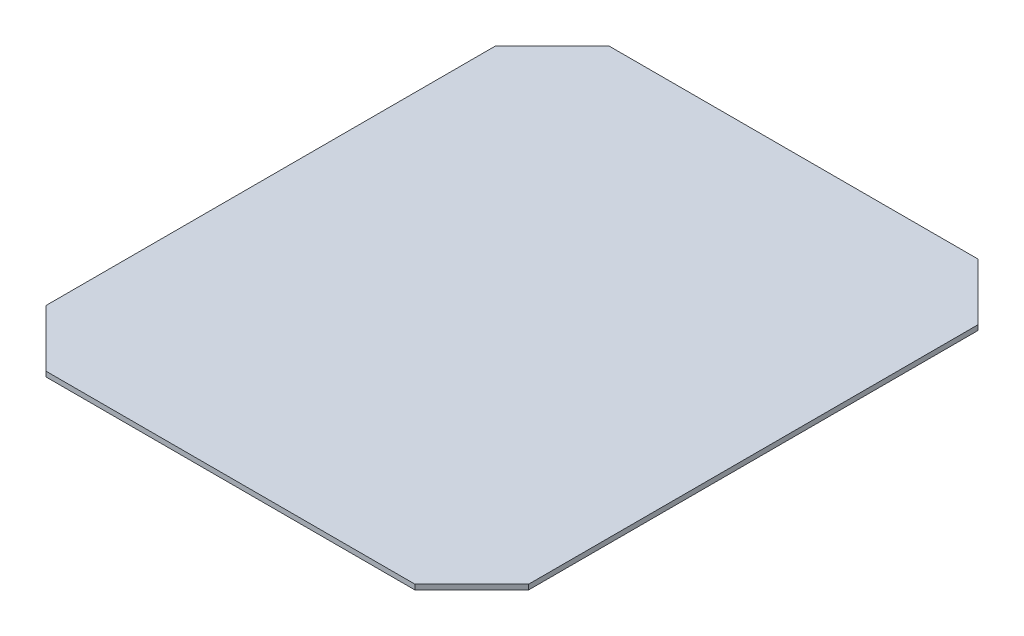
ISO-10303-21;
HEADER;
FILE_DESCRIPTION(('STEP AP214'),'2;1');
FILE_NAME('part.step','',(''),(''),'','','');
FILE_SCHEMA(('AUTOMOTIVE_DESIGN { 1 0 10303 214 1 1 1 1 }'));
ENDSEC;
DATA;
#1=APPLICATION_CONTEXT('core data for automotive mechanical design processes');
#2=APPLICATION_PROTOCOL_DEFINITION('international standard','automotive_design',2000,#1);
#3=PRODUCT_CONTEXT('',#1,'mechanical');
#4=PRODUCT('Part','Part','',(#3));
#5=PRODUCT_RELATED_PRODUCT_CATEGORY('part','',(#4));
#6=PRODUCT_DEFINITION_FORMATION('','',#4);
#7=PRODUCT_DEFINITION_CONTEXT('part definition',#1,'design');
#8=PRODUCT_DEFINITION('design','',#6,#7);
#9=PRODUCT_DEFINITION_SHAPE('','',#8);
#10=(LENGTH_UNIT() NAMED_UNIT(*) SI_UNIT(.MILLI.,.METRE.));
#11=(NAMED_UNIT(*) PLANE_ANGLE_UNIT() SI_UNIT($,.RADIAN.));
#12=(NAMED_UNIT(*) SI_UNIT($,.STERADIAN.) SOLID_ANGLE_UNIT());
#13=UNCERTAINTY_MEASURE_WITH_UNIT(LENGTH_MEASURE(1.E-05),#10,'distance_accuracy_value','');
#14=(GEOMETRIC_REPRESENTATION_CONTEXT(3) GLOBAL_UNCERTAINTY_ASSIGNED_CONTEXT((#13)) GLOBAL_UNIT_ASSIGNED_CONTEXT((#10,
#11,#12)) REPRESENTATION_CONTEXT('',''));
#15=CARTESIAN_POINT('',(0.,0.,0.));
#16=DIRECTION('',(0.,0.,1.));
#17=DIRECTION('',(1.,0.,0.));
#18=AXIS2_PLACEMENT_3D('',#15,#16,#17);
#19=CARTESIAN_POINT('',(-61.7660498386658,3.175,0.));
#20=DIRECTION('',(1.,0.,0.));
#21=DIRECTION('',(0.,0.,-1.));
#22=AXIS2_PLACEMENT_3D('',#19,#20,#21);
#23=PLANE('',#22);
#24=DIRECTION('',(0.,0.,1.));
#25=VECTOR('',#24,1.);
#26=CARTESIAN_POINT('',(-61.7660498386658,0.,0.));
#27=LINE('',#26,#25);
#28=CARTESIAN_POINT('',(-61.7660498386658,0.,-66.5353355825896));
#29=VERTEX_POINT('',#28);
#30=CARTESIAN_POINT('',(-61.7660498386657,0.,217.222615448857));
#31=VERTEX_POINT('',#30);
#32=EDGE_CURVE('E132',#29,#31,#27,.T.);
#33=ORIENTED_EDGE('',*,*,#32,.T.);
#34=DIRECTION('',(0.,-1.,0.));
#35=VECTOR('',#34,1.);
#36=CARTESIAN_POINT('',(-61.7660498386657,3.175,217.222615448857));
#37=LINE('',#36,#35);
#38=CARTESIAN_POINT('',(-61.7660498386657,3.175,217.222615448857));
#39=VERTEX_POINT('',#38);
#40=EDGE_CURVE('E11',#39,#31,#37,.T.);
#41=ORIENTED_EDGE('',*,*,#40,.F.);
#42=DIRECTION('',(0.,0.,1.));
#43=VECTOR('',#42,1.);
#44=CARTESIAN_POINT('',(-61.7660498386658,3.175,0.));
#45=LINE('',#44,#43);
#46=CARTESIAN_POINT('',(-61.7660498386658,3.175,-66.5353355825896));
#47=VERTEX_POINT('',#46);
#48=EDGE_CURVE('E151',#47,#39,#45,.T.);
#49=ORIENTED_EDGE('',*,*,#48,.F.);
#50=DIRECTION('',(0.,-1.,0.));
#51=VECTOR('',#50,1.);
#52=CARTESIAN_POINT('',(-61.7660498386658,3.175,-66.5353355825896));
#53=LINE('',#52,#51);
#54=EDGE_CURVE('E51',#47,#29,#53,.T.);
#55=ORIENTED_EDGE('',*,*,#54,.T.);
#56=EDGE_LOOP('',(#33,#41,#49,#55));
#57=FACE_BOUND('',#56,.T.);
#58=ADVANCED_FACE('F35',(#57),#23,.F.);
#59=CARTESIAN_POINT('',(-139.494332643761,3.175,139.494332643761));
#60=DIRECTION('',(0.707106781186548,0.,-0.707106781186547));
#61=DIRECTION('',(-0.707106781186547,0.,-0.707106781186548));
#62=AXIS2_PLACEMENT_3D('',#59,#60,#61);
#63=PLANE('',#62);
#64=DIRECTION('',(0.707106781186547,0.,0.707106781186548));
#65=VECTOR('',#64,1.);
#66=CARTESIAN_POINT('',(-139.494332643761,0.,139.494332643761));
#67=LINE('',#66,#65);
#68=CARTESIAN_POINT('',(-25.845025354389,0.,253.143639933134));
#69=VERTEX_POINT('',#68);
#70=EDGE_CURVE('E134',#31,#69,#67,.T.);
#71=ORIENTED_EDGE('',*,*,#70,.T.);
#72=DIRECTION('',(0.,-1.,0.));
#73=VECTOR('',#72,1.);
#74=CARTESIAN_POINT('',(-25.845025354389,3.175,253.143639933134));
#75=LINE('',#74,#73);
#76=CARTESIAN_POINT('',(-25.845025354389,3.175,253.143639933134));
#77=VERTEX_POINT('',#76);
#78=EDGE_CURVE('E43',#77,#69,#75,.T.);
#79=ORIENTED_EDGE('',*,*,#78,.F.);
#80=DIRECTION('',(0.707106781186547,0.,0.707106781186548));
#81=VECTOR('',#80,1.);
#82=CARTESIAN_POINT('',(-139.494332643761,3.175,139.494332643761));
#83=LINE('',#82,#81);
#84=EDGE_CURVE('E89',#39,#77,#83,.T.);
#85=ORIENTED_EDGE('',*,*,#84,.F.);
#86=ORIENTED_EDGE('',*,*,#40,.T.);
#87=EDGE_LOOP('',(#71,#79,#85,#86));
#88=FACE_BOUND('',#87,.T.);
#89=ADVANCED_FACE('F178',(#88),#63,.F.);
#90=CARTESIAN_POINT('',(0.,3.175,253.143639933134));
#91=DIRECTION('',(0.,0.,-1.));
#92=DIRECTION('',(-1.,0.,0.));
#93=AXIS2_PLACEMENT_3D('',#90,#91,#92);
#94=PLANE('',#93);
#95=DIRECTION('',(1.,0.,0.));
#96=VECTOR('',#95,1.);
#97=CARTESIAN_POINT('',(0.,0.,253.143639933134));
#98=LINE('',#97,#96);
#99=CARTESIAN_POINT('',(207.112925677058,0.,253.143639933134));
#100=VERTEX_POINT('',#99);
#101=EDGE_CURVE('E136',#69,#100,#98,.T.);
#102=ORIENTED_EDGE('',*,*,#101,.T.);
#103=DIRECTION('',(0.,-1.,0.));
#104=VECTOR('',#103,1.);
#105=CARTESIAN_POINT('',(207.112925677058,3.175,253.143639933134));
#106=LINE('',#105,#104);
#107=CARTESIAN_POINT('',(207.112925677058,3.175,253.143639933134));
#108=VERTEX_POINT('',#107);
#109=EDGE_CURVE('E157',#108,#100,#106,.T.);
#110=ORIENTED_EDGE('',*,*,#109,.F.);
#111=DIRECTION('',(1.,0.,0.));
#112=VECTOR('',#111,1.);
#113=CARTESIAN_POINT('',(0.,3.175,253.143639933134));
#114=LINE('',#113,#112);
#115=EDGE_CURVE('E164',#77,#108,#114,.T.);
#116=ORIENTED_EDGE('',*,*,#115,.F.);
#117=ORIENTED_EDGE('',*,*,#78,.T.);
#118=EDGE_LOOP('',(#102,#110,#116,#117));
#119=FACE_BOUND('',#118,.T.);
#120=ADVANCED_FACE('F162',(#119),#94,.F.);
#121=CARTESIAN_POINT('',(230.128282805096,3.175,230.128282805095));
#122=DIRECTION('',(0.707106781186549,0.,0.707106781186546));
#123=DIRECTION('',(0.707106781186546,0.,-0.707106781186549));
#124=AXIS2_PLACEMENT_3D('',#121,#122,#123);
#125=PLANE('',#124);
#126=DIRECTION('',(-0.707106781186546,0.,0.707106781186549));
#127=VECTOR('',#126,1.);
#128=CARTESIAN_POINT('',(230.128282805096,0.,230.128282805095));
#129=LINE('',#128,#127);
#130=CARTESIAN_POINT('',(243.033950161334,0.,217.222615448857));
#131=VERTEX_POINT('',#130);
#132=EDGE_CURVE('E139',#131,#100,#129,.T.);
#133=ORIENTED_EDGE('',*,*,#132,.F.);
#134=DIRECTION('',(0.,-1.,0.));
#135=VECTOR('',#134,1.);
#136=CARTESIAN_POINT('',(243.033950161334,3.175,217.222615448857));
#137=LINE('',#136,#135);
#138=CARTESIAN_POINT('',(243.033950161334,3.175,217.222615448857));
#139=VERTEX_POINT('',#138);
#140=EDGE_CURVE('E155',#139,#131,#137,.T.);
#141=ORIENTED_EDGE('',*,*,#140,.F.);
#142=DIRECTION('',(-0.707106781186546,0.,0.707106781186549));
#143=VECTOR('',#142,1.);
#144=CARTESIAN_POINT('',(230.128282805096,3.175,230.128282805095));
#145=LINE('',#144,#143);
#146=EDGE_CURVE('E172',#139,#108,#145,.T.);
#147=ORIENTED_EDGE('',*,*,#146,.T.);
#148=ORIENTED_EDGE('',*,*,#109,.T.);
#149=EDGE_LOOP('',(#133,#141,#147,#148));
#150=FACE_BOUND('',#149,.T.);
#151=ADVANCED_FACE('F170',(#150),#125,.T.);
#152=CARTESIAN_POINT('',(243.033950161334,3.175,0.));
#153=DIRECTION('',(1.,0.,0.));
#154=DIRECTION('',(0.,0.,-1.));
#155=AXIS2_PLACEMENT_3D('',#152,#153,#154);
#156=PLANE('',#155);
#157=DIRECTION('',(0.,0.,1.));
#158=VECTOR('',#157,1.);
#159=CARTESIAN_POINT('',(243.033950161334,0.,0.));
#160=LINE('',#159,#158);
#161=CARTESIAN_POINT('',(243.033950161334,0.,-66.5353355825896));
#162=VERTEX_POINT('',#161);
#163=EDGE_CURVE('E142',#162,#131,#160,.T.);
#164=ORIENTED_EDGE('',*,*,#163,.F.);
#165=DIRECTION('',(0.,-1.,0.));
#166=VECTOR('',#165,1.);
#167=CARTESIAN_POINT('',(243.033950161334,3.175,-66.5353355825896));
#168=LINE('',#167,#166);
#169=CARTESIAN_POINT('',(243.033950161334,3.175,-66.5353355825896));
#170=VERTEX_POINT('',#169);
#171=EDGE_CURVE('E124',#170,#162,#168,.T.);
#172=ORIENTED_EDGE('',*,*,#171,.F.);
#173=DIRECTION('',(0.,0.,1.));
#174=VECTOR('',#173,1.);
#175=CARTESIAN_POINT('',(243.033950161334,3.175,0.));
#176=LINE('',#175,#174);
#177=EDGE_CURVE('E114',#170,#139,#176,.T.);
#178=ORIENTED_EDGE('',*,*,#177,.T.);
#179=ORIENTED_EDGE('',*,*,#140,.T.);
#180=EDGE_LOOP('',(#164,#172,#178,#179));
#181=FACE_BOUND('',#180,.T.);
#182=ADVANCED_FACE('F188',(#181),#156,.T.);
#183=CARTESIAN_POINT('',(154.784642871962,3.175,-154.784642871962));
#184=DIRECTION('',(-0.707106781186549,0.,0.707106781186546));
#185=DIRECTION('',(0.707106781186546,0.,0.707106781186549));
#186=AXIS2_PLACEMENT_3D('',#183,#184,#185);
#187=PLANE('',#186);
#188=DIRECTION('',(-0.707106781186546,0.,-0.707106781186549));
#189=VECTOR('',#188,1.);
#190=CARTESIAN_POINT('',(154.784642871962,0.,-154.784642871962));
#191=LINE('',#190,#189);
#192=CARTESIAN_POINT('',(207.112925677058,0.,-102.456360066866));
#193=VERTEX_POINT('',#192);
#194=EDGE_CURVE('E121',#162,#193,#191,.T.);
#195=ORIENTED_EDGE('',*,*,#194,.T.);
#196=DIRECTION('',(0.,-1.,0.));
#197=VECTOR('',#196,1.);
#198=CARTESIAN_POINT('',(207.112925677058,3.175,-102.456360066866));
#199=LINE('',#198,#197);
#200=CARTESIAN_POINT('',(207.112925677058,3.175,-102.456360066866));
#201=VERTEX_POINT('',#200);
#202=EDGE_CURVE('E118',#201,#193,#199,.T.);
#203=ORIENTED_EDGE('',*,*,#202,.F.);
#204=DIRECTION('',(-0.707106781186546,0.,-0.707106781186549));
#205=VECTOR('',#204,1.);
#206=CARTESIAN_POINT('',(154.784642871962,3.175,-154.784642871962));
#207=LINE('',#206,#205);
#208=EDGE_CURVE('E106',#170,#201,#207,.T.);
#209=ORIENTED_EDGE('',*,*,#208,.F.);
#210=ORIENTED_EDGE('',*,*,#171,.T.);
#211=EDGE_LOOP('',(#195,#203,#209,#210));
#212=FACE_BOUND('',#211,.T.);
#213=ADVANCED_FACE('F119',(#212),#187,.F.);
#214=CARTESIAN_POINT('',(0.,3.175,-102.456360066866));
#215=DIRECTION('',(0.,0.,-1.));
#216=DIRECTION('',(-1.,0.,0.));
#217=AXIS2_PLACEMENT_3D('',#214,#215,#216);
#218=PLANE('',#217);
#219=DIRECTION('',(1.,0.,0.));
#220=VECTOR('',#219,1.);
#221=CARTESIAN_POINT('',(0.,0.,-102.456360066866));
#222=LINE('',#221,#220);
#223=CARTESIAN_POINT('',(-25.8450253543892,0.,-102.456360066866));
#224=VERTEX_POINT('',#223);
#225=EDGE_CURVE('E146',#224,#193,#222,.T.);
#226=ORIENTED_EDGE('',*,*,#225,.F.);
#227=DIRECTION('',(0.,-1.,0.));
#228=VECTOR('',#227,1.);
#229=CARTESIAN_POINT('',(-25.8450253543892,3.175,-102.456360066866));
#230=LINE('',#229,#228);
#231=CARTESIAN_POINT('',(-25.8450253543892,3.175,-102.456360066866));
#232=VERTEX_POINT('',#231);
#233=EDGE_CURVE('E77',#232,#224,#230,.T.);
#234=ORIENTED_EDGE('',*,*,#233,.F.);
#235=DIRECTION('',(1.,0.,0.));
#236=VECTOR('',#235,1.);
#237=CARTESIAN_POINT('',(0.,3.175,-102.456360066866));
#238=LINE('',#237,#236);
#239=EDGE_CURVE('E111',#232,#201,#238,.T.);
#240=ORIENTED_EDGE('',*,*,#239,.T.);
#241=ORIENTED_EDGE('',*,*,#202,.T.);
#242=EDGE_LOOP('',(#226,#234,#240,#241));
#243=FACE_BOUND('',#242,.T.);
#244=ADVANCED_FACE('F126',(#243),#218,.T.);
#245=CARTESIAN_POINT('',(-64.1506927106278,3.175,-64.1506927106276));
#246=DIRECTION('',(-0.707106781186549,0.,-0.707106781186546));
#247=DIRECTION('',(-0.707106781186546,0.,0.707106781186549));
#248=AXIS2_PLACEMENT_3D('',#245,#246,#247);
#249=PLANE('',#248);
#250=DIRECTION('',(0.707106781186546,0.,-0.707106781186549));
#251=VECTOR('',#250,1.);
#252=CARTESIAN_POINT('',(-64.1506927106278,0.,-64.1506927106276));
#253=LINE('',#252,#251);
#254=EDGE_CURVE('E148',#29,#224,#253,.T.);
#255=ORIENTED_EDGE('',*,*,#254,.F.);
#256=ORIENTED_EDGE('',*,*,#54,.F.);
#257=DIRECTION('',(0.707106781186546,0.,-0.707106781186549));
#258=VECTOR('',#257,1.);
#259=CARTESIAN_POINT('',(-64.1506927106278,3.175,-64.1506927106276));
#260=LINE('',#259,#258);
#261=EDGE_CURVE('E127',#47,#232,#260,.T.);
#262=ORIENTED_EDGE('',*,*,#261,.T.);
#263=ORIENTED_EDGE('',*,*,#233,.T.);
#264=EDGE_LOOP('',(#255,#256,#262,#263));
#265=FACE_BOUND('',#264,.T.);
#266=ADVANCED_FACE('F196',(#265),#249,.T.);
#267=CARTESIAN_POINT('',(0.,3.175,0.));
#268=DIRECTION('',(0.,1.,0.));
#269=DIRECTION('',(0.,0.,1.));
#270=AXIS2_PLACEMENT_3D('',#267,#268,#269);
#271=PLANE('',#270);
#272=ORIENTED_EDGE('',*,*,#48,.T.);
#273=ORIENTED_EDGE('',*,*,#84,.T.);
#274=ORIENTED_EDGE('',*,*,#115,.T.);
#275=ORIENTED_EDGE('',*,*,#146,.F.);
#276=ORIENTED_EDGE('',*,*,#177,.F.);
#277=ORIENTED_EDGE('',*,*,#208,.T.);
#278=ORIENTED_EDGE('',*,*,#239,.F.);
#279=ORIENTED_EDGE('',*,*,#261,.F.);
#280=EDGE_LOOP('',(#272,#273,#274,#275,#276,#277,#278,#279));
#281=FACE_BOUND('',#280,.T.);
#282=ADVANCED_FACE('F108',(#281),#271,.T.);
#283=CARTESIAN_POINT('',(0.,0.,0.));
#284=DIRECTION('',(0.,1.,0.));
#285=DIRECTION('',(0.,0.,1.));
#286=AXIS2_PLACEMENT_3D('',#283,#284,#285);
#287=PLANE('',#286);
#288=ORIENTED_EDGE('',*,*,#32,.F.);
#289=ORIENTED_EDGE('',*,*,#254,.T.);
#290=ORIENTED_EDGE('',*,*,#225,.T.);
#291=ORIENTED_EDGE('',*,*,#194,.F.);
#292=ORIENTED_EDGE('',*,*,#163,.T.);
#293=ORIENTED_EDGE('',*,*,#132,.T.);
#294=ORIENTED_EDGE('',*,*,#101,.F.);
#295=ORIENTED_EDGE('',*,*,#70,.F.);
#296=EDGE_LOOP('',(#288,#289,#290,#291,#292,#293,#294,#295));
#297=FACE_BOUND('',#296,.T.);
#298=ADVANCED_FACE('F166',(#297),#287,.F.);
#299=CLOSED_SHELL('',(#58,#89,#120,#151,#182,#213,#244,#266,#282,#298));
#300=MANIFOLD_SOLID_BREP('B2',#299);
#301=ADVANCED_BREP_SHAPE_REPRESENTATION('',(#18,#300),#14);
#302=SHAPE_DEFINITION_REPRESENTATION(#9,#301);
ENDSEC;
END-ISO-10303-21;
